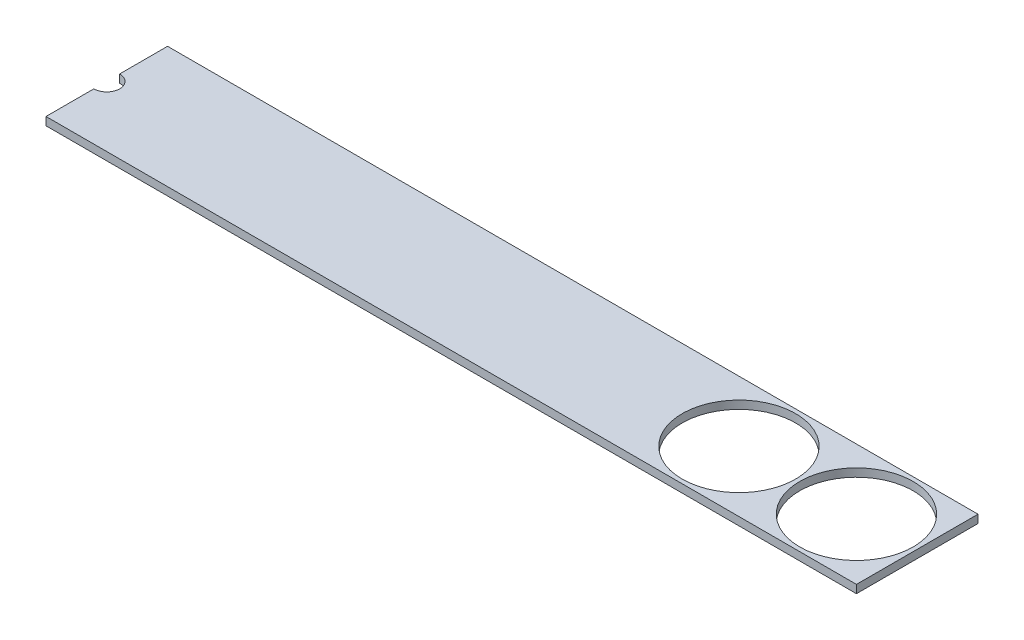
ISO-10303-21;
HEADER;
FILE_DESCRIPTION(('STEP AP214'),'2;1');
FILE_NAME('part.step','',(''),(''),'','','');
FILE_SCHEMA(('AUTOMOTIVE_DESIGN { 1 0 10303 214 1 1 1 1 }'));
ENDSEC;
DATA;
#1=APPLICATION_CONTEXT('core data for automotive mechanical design processes');
#2=APPLICATION_PROTOCOL_DEFINITION('international standard','automotive_design',2000,#1);
#3=PRODUCT_CONTEXT('',#1,'mechanical');
#4=PRODUCT('Part','Part','',(#3));
#5=PRODUCT_RELATED_PRODUCT_CATEGORY('part','',(#4));
#6=PRODUCT_DEFINITION_FORMATION('','',#4);
#7=PRODUCT_DEFINITION_CONTEXT('part definition',#1,'design');
#8=PRODUCT_DEFINITION('design','',#6,#7);
#9=PRODUCT_DEFINITION_SHAPE('','',#8);
#10=(LENGTH_UNIT() NAMED_UNIT(*) SI_UNIT(.MILLI.,.METRE.));
#11=(NAMED_UNIT(*) PLANE_ANGLE_UNIT() SI_UNIT($,.RADIAN.));
#12=(NAMED_UNIT(*) SI_UNIT($,.STERADIAN.) SOLID_ANGLE_UNIT());
#13=UNCERTAINTY_MEASURE_WITH_UNIT(LENGTH_MEASURE(1.E-05),#10,'distance_accuracy_value','');
#14=(GEOMETRIC_REPRESENTATION_CONTEXT(3) GLOBAL_UNCERTAINTY_ASSIGNED_CONTEXT((#13)) GLOBAL_UNIT_ASSIGNED_CONTEXT((#10,
#11,#12)) REPRESENTATION_CONTEXT('',''));
#15=CARTESIAN_POINT('',(0.,0.,0.));
#16=DIRECTION('',(0.,0.,1.));
#17=DIRECTION('',(1.,0.,0.));
#18=AXIS2_PLACEMENT_3D('',#15,#16,#17);
#19=CARTESIAN_POINT('',(-100.,2.,-15.));
#20=DIRECTION('',(1.,0.,0.));
#21=DIRECTION('',(0.,0.,-1.));
#22=AXIS2_PLACEMENT_3D('',#19,#20,#21);
#23=PLANE('',#22);
#24=DIRECTION('',(0.,-1.,0.));
#25=VECTOR('',#24,1.);
#26=CARTESIAN_POINT('',(-100.,10.,3.185));
#27=LINE('',#26,#25);
#28=CARTESIAN_POINT('',(-100.,0.,3.185));
#29=VERTEX_POINT('',#28);
#30=CARTESIAN_POINT('',(-100.,2.,3.185));
#31=VERTEX_POINT('',#30);
#32=EDGE_CURVE('E12',#29,#31,#27,.F.);
#33=ORIENTED_EDGE('',*,*,#32,.F.);
#34=DIRECTION('',(0.,0.,1.));
#35=VECTOR('',#34,1.);
#36=CARTESIAN_POINT('',(-100.,0.,-15.));
#37=LINE('',#36,#35);
#38=CARTESIAN_POINT('',(-100.,0.,15.));
#39=VERTEX_POINT('',#38);
#40=EDGE_CURVE('E114',#29,#39,#37,.T.);
#41=ORIENTED_EDGE('',*,*,#40,.T.);
#42=DIRECTION('',(0.,-1.,0.));
#43=VECTOR('',#42,1.);
#44=CARTESIAN_POINT('',(-100.,2.,15.));
#45=LINE('',#44,#43);
#46=CARTESIAN_POINT('',(-100.,2.,15.));
#47=VERTEX_POINT('',#46);
#48=EDGE_CURVE('E153',#47,#39,#45,.T.);
#49=ORIENTED_EDGE('',*,*,#48,.F.);
#50=DIRECTION('',(0.,0.,1.));
#51=VECTOR('',#50,1.);
#52=CARTESIAN_POINT('',(-100.,2.,-15.));
#53=LINE('',#52,#51);
#54=EDGE_CURVE('E92',#31,#47,#53,.T.);
#55=ORIENTED_EDGE('',*,*,#54,.F.);
#56=EDGE_LOOP('',(#33,#41,#49,#55));
#57=FACE_BOUND('',#56,.T.);
#58=ADVANCED_FACE('F69',(#57),#23,.F.);
#59=DIRECTION('',(0.,-1.,0.));
#60=VECTOR('',#59,1.);
#61=CARTESIAN_POINT('',(-100.,10.,-3.18499999999999));
#62=LINE('',#61,#60);
#63=CARTESIAN_POINT('',(-100.,2.,-3.18499999999999));
#64=VERTEX_POINT('',#63);
#65=CARTESIAN_POINT('',(-100.,0.,-3.18499999999999));
#66=VERTEX_POINT('',#65);
#67=EDGE_CURVE('E78',#64,#66,#62,.T.);
#68=ORIENTED_EDGE('',*,*,#67,.F.);
#69=CARTESIAN_POINT('',(-100.,2.,-15.));
#70=VERTEX_POINT('',#69);
#71=EDGE_CURVE('E157',#70,#64,#53,.T.);
#72=ORIENTED_EDGE('',*,*,#71,.F.);
#73=DIRECTION('',(0.,-1.,0.));
#74=VECTOR('',#73,1.);
#75=CARTESIAN_POINT('',(-100.,2.,-15.));
#76=LINE('',#75,#74);
#77=CARTESIAN_POINT('',(-100.,0.,-15.));
#78=VERTEX_POINT('',#77);
#79=EDGE_CURVE('E156',#70,#78,#76,.T.);
#80=ORIENTED_EDGE('',*,*,#79,.T.);
#81=EDGE_CURVE('E143',#78,#66,#37,.T.);
#82=ORIENTED_EDGE('',*,*,#81,.T.);
#83=EDGE_LOOP('',(#68,#72,#80,#82));
#84=FACE_BOUND('',#83,.T.);
#85=ADVANCED_FACE('F202',(#84),#23,.F.);
#86=CARTESIAN_POINT('',(0.,2.,0.));
#87=DIRECTION('',(0.,-1.,0.));
#88=DIRECTION('',(0.,0.,-1.));
#89=AXIS2_PLACEMENT_3D('',#86,#87,#88);
#90=PLANE('',#89);
#91=CARTESIAN_POINT('',(-100.,2.,0.));
#92=DIRECTION('',(0.,-1.,0.));
#93=DIRECTION('',(0.,0.,-1.));
#94=AXIS2_PLACEMENT_3D('',#91,#92,#93);
#95=CIRCLE('',#94,3.18499999999999);
#96=EDGE_CURVE('E84',#31,#64,#95,.F.);
#97=ORIENTED_EDGE('',*,*,#96,.F.);
#98=ORIENTED_EDGE('',*,*,#54,.T.);
#99=DIRECTION('',(1.,0.,0.));
#100=VECTOR('',#99,1.);
#101=CARTESIAN_POINT('',(-100.,2.,15.));
#102=LINE('',#101,#100);
#103=CARTESIAN_POINT('',(100.,2.,15.));
#104=VERTEX_POINT('',#103);
#105=EDGE_CURVE('E119',#47,#104,#102,.T.);
#106=ORIENTED_EDGE('',*,*,#105,.T.);
#107=DIRECTION('',(0.,0.,1.));
#108=VECTOR('',#107,1.);
#109=CARTESIAN_POINT('',(100.,2.,-15.));
#110=LINE('',#109,#108);
#111=CARTESIAN_POINT('',(100.,2.,-15.));
#112=VERTEX_POINT('',#111);
#113=EDGE_CURVE('E174',#112,#104,#110,.T.);
#114=ORIENTED_EDGE('',*,*,#113,.F.);
#115=DIRECTION('',(1.,0.,0.));
#116=VECTOR('',#115,1.);
#117=CARTESIAN_POINT('',(-100.,2.,-15.));
#118=LINE('',#117,#116);
#119=EDGE_CURVE('E171',#70,#112,#118,.T.);
#120=ORIENTED_EDGE('',*,*,#119,.F.);
#121=ORIENTED_EDGE('',*,*,#71,.T.);
#122=EDGE_LOOP('',(#97,#98,#106,#114,#120,#121));
#123=FACE_BOUND('',#122,.T.);
#124=CARTESIAN_POINT('',(56.,2.,0.));
#125=DIRECTION('',(0.,1.,0.));
#126=DIRECTION('',(0.,0.,1.));
#127=AXIS2_PLACEMENT_3D('',#124,#125,#126);
#128=CIRCLE('',#127,14.);
#129=CARTESIAN_POINT('',(56.,2.,14.));
#130=VERTEX_POINT('',#129);
#131=EDGE_CURVE('E185',#130,#130,#128,.T.);
#132=ORIENTED_EDGE('',*,*,#131,.F.);
#133=EDGE_LOOP('',(#132));
#134=FACE_BOUND('',#133,.T.);
#135=CARTESIAN_POINT('',(85.,2.,0.));
#136=DIRECTION('',(0.,1.,0.));
#137=DIRECTION('',(0.,0.,1.));
#138=AXIS2_PLACEMENT_3D('',#135,#136,#137);
#139=CIRCLE('',#138,14.);
#140=CARTESIAN_POINT('',(85.,2.,14.));
#141=VERTEX_POINT('',#140);
#142=EDGE_CURVE('E227',#141,#141,#139,.T.);
#143=ORIENTED_EDGE('',*,*,#142,.F.);
#144=EDGE_LOOP('',(#143));
#145=FACE_BOUND('',#144,.T.);
#146=ADVANCED_FACE('F198',(#123,#134,#145),#90,.F.);
#147=CARTESIAN_POINT('',(0.,0.,0.));
#148=DIRECTION('',(0.,-1.,0.));
#149=DIRECTION('',(0.,0.,-1.));
#150=AXIS2_PLACEMENT_3D('',#147,#148,#149);
#151=PLANE('',#150);
#152=CARTESIAN_POINT('',(56.,0.,0.));
#153=DIRECTION('',(0.,1.,0.));
#154=DIRECTION('',(0.,0.,1.));
#155=AXIS2_PLACEMENT_3D('',#152,#153,#154);
#156=CIRCLE('',#155,14.);
#157=CARTESIAN_POINT('',(56.,0.,14.));
#158=VERTEX_POINT('',#157);
#159=EDGE_CURVE('E181',#158,#158,#156,.T.);
#160=ORIENTED_EDGE('',*,*,#159,.T.);
#161=EDGE_LOOP('',(#160));
#162=FACE_BOUND('',#161,.T.);
#163=ORIENTED_EDGE('',*,*,#40,.F.);
#164=CARTESIAN_POINT('',(-100.,0.,0.));
#165=DIRECTION('',(0.,1.,0.));
#166=DIRECTION('',(0.,0.,1.));
#167=AXIS2_PLACEMENT_3D('',#164,#165,#166);
#168=CIRCLE('',#167,3.18499999999999);
#169=EDGE_CURVE('E129',#29,#66,#168,.T.);
#170=ORIENTED_EDGE('',*,*,#169,.T.);
#171=ORIENTED_EDGE('',*,*,#81,.F.);
#172=DIRECTION('',(1.,0.,0.));
#173=VECTOR('',#172,1.);
#174=CARTESIAN_POINT('',(-100.,0.,-15.));
#175=LINE('',#174,#173);
#176=CARTESIAN_POINT('',(100.,0.,-15.));
#177=VERTEX_POINT('',#176);
#178=EDGE_CURVE('E144',#78,#177,#175,.T.);
#179=ORIENTED_EDGE('',*,*,#178,.T.);
#180=DIRECTION('',(0.,0.,1.));
#181=VECTOR('',#180,1.);
#182=CARTESIAN_POINT('',(100.,0.,-15.));
#183=LINE('',#182,#181);
#184=CARTESIAN_POINT('',(100.,0.,15.));
#185=VERTEX_POINT('',#184);
#186=EDGE_CURVE('E149',#177,#185,#183,.T.);
#187=ORIENTED_EDGE('',*,*,#186,.T.);
#188=DIRECTION('',(1.,0.,0.));
#189=VECTOR('',#188,1.);
#190=CARTESIAN_POINT('',(-100.,0.,15.));
#191=LINE('',#190,#189);
#192=EDGE_CURVE('E141',#39,#185,#191,.T.);
#193=ORIENTED_EDGE('',*,*,#192,.F.);
#194=EDGE_LOOP('',(#163,#170,#171,#179,#187,#193));
#195=FACE_BOUND('',#194,.T.);
#196=CARTESIAN_POINT('',(85.,0.,0.));
#197=DIRECTION('',(0.,1.,0.));
#198=DIRECTION('',(0.,0.,1.));
#199=AXIS2_PLACEMENT_3D('',#196,#197,#198);
#200=CIRCLE('',#199,14.);
#201=CARTESIAN_POINT('',(85.,0.,14.));
#202=VERTEX_POINT('',#201);
#203=EDGE_CURVE('E223',#202,#202,#200,.T.);
#204=ORIENTED_EDGE('',*,*,#203,.T.);
#205=EDGE_LOOP('',(#204));
#206=FACE_BOUND('',#205,.T.);
#207=ADVANCED_FACE('F137',(#162,#195,#206),#151,.T.);
#208=CARTESIAN_POINT('',(-100.,2.,15.));
#209=DIRECTION('',(0.,0.,-1.));
#210=DIRECTION('',(-1.,0.,0.));
#211=AXIS2_PLACEMENT_3D('',#208,#209,#210);
#212=PLANE('',#211);
#213=ORIENTED_EDGE('',*,*,#192,.T.);
#214=DIRECTION('',(0.,-1.,0.));
#215=VECTOR('',#214,1.);
#216=CARTESIAN_POINT('',(100.,2.,15.));
#217=LINE('',#216,#215);
#218=EDGE_CURVE('E163',#104,#185,#217,.T.);
#219=ORIENTED_EDGE('',*,*,#218,.F.);
#220=ORIENTED_EDGE('',*,*,#105,.F.);
#221=ORIENTED_EDGE('',*,*,#48,.T.);
#222=EDGE_LOOP('',(#213,#219,#220,#221));
#223=FACE_BOUND('',#222,.T.);
#224=ADVANCED_FACE('F71',(#223),#212,.F.);
#225=CARTESIAN_POINT('',(100.,2.,-15.));
#226=DIRECTION('',(1.,0.,0.));
#227=DIRECTION('',(0.,0.,-1.));
#228=AXIS2_PLACEMENT_3D('',#225,#226,#227);
#229=PLANE('',#228);
#230=ORIENTED_EDGE('',*,*,#186,.F.);
#231=DIRECTION('',(0.,-1.,0.));
#232=VECTOR('',#231,1.);
#233=CARTESIAN_POINT('',(100.,2.,-15.));
#234=LINE('',#233,#232);
#235=EDGE_CURVE('E160',#112,#177,#234,.T.);
#236=ORIENTED_EDGE('',*,*,#235,.F.);
#237=ORIENTED_EDGE('',*,*,#113,.T.);
#238=ORIENTED_EDGE('',*,*,#218,.T.);
#239=EDGE_LOOP('',(#230,#236,#237,#238));
#240=FACE_BOUND('',#239,.T.);
#241=ADVANCED_FACE('F190',(#240),#229,.T.);
#242=CARTESIAN_POINT('',(-100.,2.,-15.));
#243=DIRECTION('',(0.,0.,-1.));
#244=DIRECTION('',(-1.,0.,0.));
#245=AXIS2_PLACEMENT_3D('',#242,#243,#244);
#246=PLANE('',#245);
#247=ORIENTED_EDGE('',*,*,#178,.F.);
#248=ORIENTED_EDGE('',*,*,#79,.F.);
#249=ORIENTED_EDGE('',*,*,#119,.T.);
#250=ORIENTED_EDGE('',*,*,#235,.T.);
#251=EDGE_LOOP('',(#247,#248,#249,#250));
#252=FACE_BOUND('',#251,.T.);
#253=ADVANCED_FACE('F197',(#252),#246,.T.);
#254=CARTESIAN_POINT('',(56.,2.,0.));
#255=DIRECTION('',(0.,-1.,0.));
#256=DIRECTION('',(0.,0.,-1.));
#257=AXIS2_PLACEMENT_3D('',#254,#255,#256);
#258=CYLINDRICAL_SURFACE('',#257,14.);
#259=ORIENTED_EDGE('',*,*,#131,.T.);
#260=EDGE_LOOP('',(#259));
#261=FACE_BOUND('',#260,.T.);
#262=ORIENTED_EDGE('',*,*,#159,.F.);
#263=EDGE_LOOP('',(#262));
#264=FACE_BOUND('',#263,.T.);
#265=ADVANCED_FACE('F211',(#261,#264),#258,.F.);
#266=CARTESIAN_POINT('',(85.,2.,0.));
#267=DIRECTION('',(0.,-1.,0.));
#268=DIRECTION('',(0.,0.,-1.));
#269=AXIS2_PLACEMENT_3D('',#266,#267,#268);
#270=CYLINDRICAL_SURFACE('',#269,14.);
#271=ORIENTED_EDGE('',*,*,#142,.T.);
#272=EDGE_LOOP('',(#271));
#273=FACE_BOUND('',#272,.T.);
#274=ORIENTED_EDGE('',*,*,#203,.F.);
#275=EDGE_LOOP('',(#274));
#276=FACE_BOUND('',#275,.T.);
#277=ADVANCED_FACE('F216',(#273,#276),#270,.F.);
#278=CARTESIAN_POINT('',(-100.,10.,0.));
#279=DIRECTION('',(0.,-1.,0.));
#280=DIRECTION('',(0.,0.,-1.));
#281=AXIS2_PLACEMENT_3D('',#278,#279,#280);
#282=CYLINDRICAL_SURFACE('',#281,3.18499999999999);
#283=ORIENTED_EDGE('',*,*,#32,.T.);
#284=ORIENTED_EDGE('',*,*,#96,.T.);
#285=ORIENTED_EDGE('',*,*,#67,.T.);
#286=ORIENTED_EDGE('',*,*,#169,.F.);
#287=EDGE_LOOP('',(#283,#284,#285,#286));
#288=FACE_BOUND('',#287,.T.);
#289=ADVANCED_FACE('F130',(#288),#282,.F.);
#290=CLOSED_SHELL('',(#58,#85,#146,#207,#224,#241,#253,#265,#277,#289));
#291=MANIFOLD_SOLID_BREP('B2',#290);
#292=ADVANCED_BREP_SHAPE_REPRESENTATION('',(#18,#291),#14);
#293=SHAPE_DEFINITION_REPRESENTATION(#9,#292);
ENDSEC;
END-ISO-10303-21;
